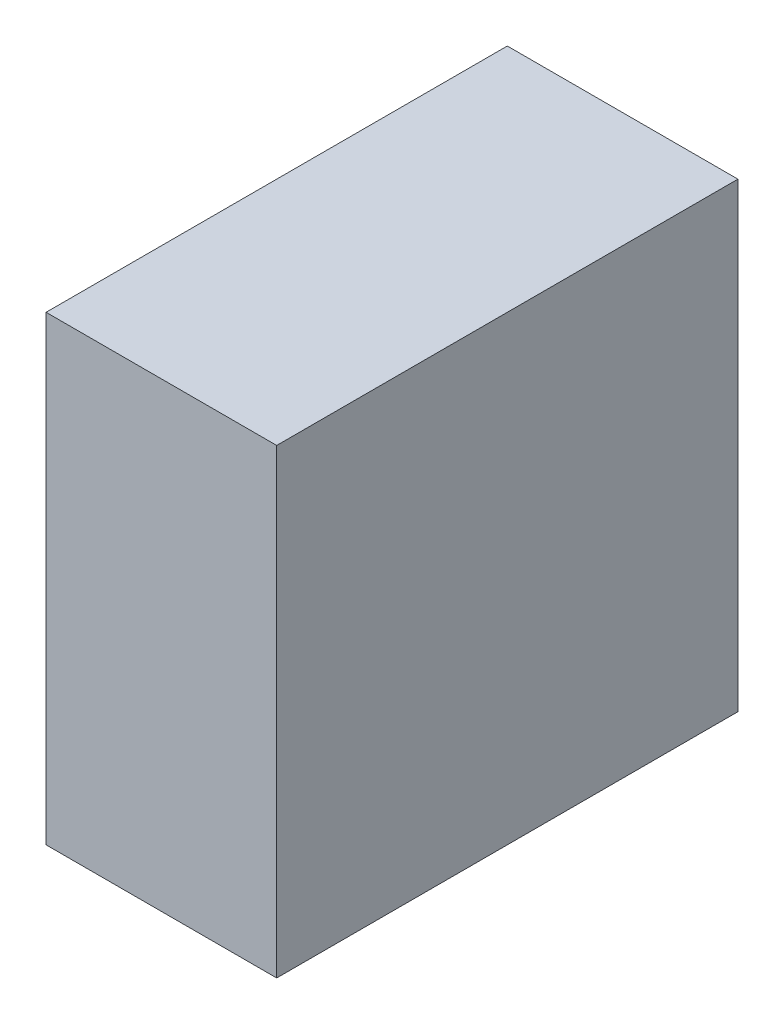
ISO-10303-21;
HEADER;
FILE_DESCRIPTION(('STEP AP214'),'2;1');
FILE_NAME('part.step','',(''),(''),'','','');
FILE_SCHEMA(('AUTOMOTIVE_DESIGN { 1 0 10303 214 1 1 1 1 }'));
ENDSEC;
DATA;
#1=APPLICATION_CONTEXT('core data for automotive mechanical design processes');
#2=APPLICATION_PROTOCOL_DEFINITION('international standard','automotive_design',2000,#1);
#3=PRODUCT_CONTEXT('',#1,'mechanical');
#4=PRODUCT('Part','Part','',(#3));
#5=PRODUCT_RELATED_PRODUCT_CATEGORY('part','',(#4));
#6=PRODUCT_DEFINITION_FORMATION('','',#4);
#7=PRODUCT_DEFINITION_CONTEXT('part definition',#1,'design');
#8=PRODUCT_DEFINITION('design','',#6,#7);
#9=PRODUCT_DEFINITION_SHAPE('','',#8);
#10=(LENGTH_UNIT() NAMED_UNIT(*) SI_UNIT(.MILLI.,.METRE.));
#11=(NAMED_UNIT(*) PLANE_ANGLE_UNIT() SI_UNIT($,.RADIAN.));
#12=(NAMED_UNIT(*) SI_UNIT($,.STERADIAN.) SOLID_ANGLE_UNIT());
#13=UNCERTAINTY_MEASURE_WITH_UNIT(LENGTH_MEASURE(1.E-05),#10,'distance_accuracy_value','');
#14=(GEOMETRIC_REPRESENTATION_CONTEXT(3) GLOBAL_UNCERTAINTY_ASSIGNED_CONTEXT((#13)) GLOBAL_UNIT_ASSIGNED_CONTEXT((#10,
#11,#12)) REPRESENTATION_CONTEXT('',''));
#15=CARTESIAN_POINT('',(0.,0.,0.));
#16=DIRECTION('',(0.,0.,1.));
#17=DIRECTION('',(1.,0.,0.));
#18=AXIS2_PLACEMENT_3D('',#15,#16,#17);
#19=CARTESIAN_POINT('',(15.,-30.,30.));
#20=DIRECTION('',(-1.,0.,0.));
#21=DIRECTION('',(0.,0.,1.));
#22=AXIS2_PLACEMENT_3D('',#19,#20,#21);
#23=PLANE('',#22);
#24=DIRECTION('',(0.,1.,0.));
#25=VECTOR('',#24,1.);
#26=CARTESIAN_POINT('',(15.,-30.,-30.));
#27=LINE('',#26,#25);
#28=CARTESIAN_POINT('',(15.,-30.,-30.));
#29=VERTEX_POINT('',#28);
#30=CARTESIAN_POINT('',(15.,30.,-30.));
#31=VERTEX_POINT('',#30);
#32=EDGE_CURVE('E107',#29,#31,#27,.T.);
#33=ORIENTED_EDGE('',*,*,#32,.T.);
#34=DIRECTION('',(0.,0.,-1.));
#35=VECTOR('',#34,1.);
#36=CARTESIAN_POINT('',(15.,30.,30.));
#37=LINE('',#36,#35);
#38=CARTESIAN_POINT('',(15.,30.,30.));
#39=VERTEX_POINT('',#38);
#40=EDGE_CURVE('E11',#39,#31,#37,.T.);
#41=ORIENTED_EDGE('',*,*,#40,.F.);
#42=DIRECTION('',(0.,1.,0.));
#43=VECTOR('',#42,1.);
#44=CARTESIAN_POINT('',(15.,-30.,30.));
#45=LINE('',#44,#43);
#46=CARTESIAN_POINT('',(15.,-30.,30.));
#47=VERTEX_POINT('',#46);
#48=EDGE_CURVE('E91',#47,#39,#45,.T.);
#49=ORIENTED_EDGE('',*,*,#48,.F.);
#50=DIRECTION('',(0.,0.,-1.));
#51=VECTOR('',#50,1.);
#52=CARTESIAN_POINT('',(15.,-30.,30.));
#53=LINE('',#52,#51);
#54=EDGE_CURVE('E103',#47,#29,#53,.T.);
#55=ORIENTED_EDGE('',*,*,#54,.T.);
#56=EDGE_LOOP('',(#33,#41,#49,#55));
#57=FACE_BOUND('',#56,.T.);
#58=ADVANCED_FACE('F39',(#57),#23,.F.);
#59=CARTESIAN_POINT('',(-15.,30.,30.));
#60=DIRECTION('',(0.,-1.,0.));
#61=DIRECTION('',(0.,0.,-1.));
#62=AXIS2_PLACEMENT_3D('',#59,#60,#61);
#63=PLANE('',#62);
#64=DIRECTION('',(-1.,0.,0.));
#65=VECTOR('',#64,1.);
#66=CARTESIAN_POINT('',(-15.,30.,-30.));
#67=LINE('',#66,#65);
#68=CARTESIAN_POINT('',(-15.,30.,-30.));
#69=VERTEX_POINT('',#68);
#70=EDGE_CURVE('E96',#31,#69,#67,.T.);
#71=ORIENTED_EDGE('',*,*,#70,.T.);
#72=DIRECTION('',(0.,0.,-1.));
#73=VECTOR('',#72,1.);
#74=CARTESIAN_POINT('',(-15.,30.,30.));
#75=LINE('',#74,#73);
#76=CARTESIAN_POINT('',(-15.,30.,30.));
#77=VERTEX_POINT('',#76);
#78=EDGE_CURVE('E48',#77,#69,#75,.T.);
#79=ORIENTED_EDGE('',*,*,#78,.F.);
#80=DIRECTION('',(-1.,0.,0.));
#81=VECTOR('',#80,1.);
#82=CARTESIAN_POINT('',(-15.,30.,30.));
#83=LINE('',#82,#81);
#84=EDGE_CURVE('E86',#39,#77,#83,.T.);
#85=ORIENTED_EDGE('',*,*,#84,.F.);
#86=ORIENTED_EDGE('',*,*,#40,.T.);
#87=EDGE_LOOP('',(#71,#79,#85,#86));
#88=FACE_BOUND('',#87,.T.);
#89=ADVANCED_FACE('F95',(#88),#63,.F.);
#90=CARTESIAN_POINT('',(-15.,-30.,30.));
#91=DIRECTION('',(1.,0.,0.));
#92=DIRECTION('',(0.,0.,-1.));
#93=AXIS2_PLACEMENT_3D('',#90,#91,#92);
#94=PLANE('',#93);
#95=DIRECTION('',(0.,-1.,0.));
#96=VECTOR('',#95,1.);
#97=CARTESIAN_POINT('',(-15.,-30.,-30.));
#98=LINE('',#97,#96);
#99=CARTESIAN_POINT('',(-15.,-30.,-30.));
#100=VERTEX_POINT('',#99);
#101=EDGE_CURVE('E73',#69,#100,#98,.T.);
#102=ORIENTED_EDGE('',*,*,#101,.T.);
#103=DIRECTION('',(0.,0.,-1.));
#104=VECTOR('',#103,1.);
#105=CARTESIAN_POINT('',(-15.,-30.,30.));
#106=LINE('',#105,#104);
#107=CARTESIAN_POINT('',(-15.,-30.,30.));
#108=VERTEX_POINT('',#107);
#109=EDGE_CURVE('E98',#108,#100,#106,.T.);
#110=ORIENTED_EDGE('',*,*,#109,.F.);
#111=DIRECTION('',(0.,-1.,0.));
#112=VECTOR('',#111,1.);
#113=CARTESIAN_POINT('',(-15.,-30.,30.));
#114=LINE('',#113,#112);
#115=EDGE_CURVE('E89',#77,#108,#114,.T.);
#116=ORIENTED_EDGE('',*,*,#115,.F.);
#117=ORIENTED_EDGE('',*,*,#78,.T.);
#118=EDGE_LOOP('',(#102,#110,#116,#117));
#119=FACE_BOUND('',#118,.T.);
#120=ADVANCED_FACE('F99',(#119),#94,.F.);
#121=CARTESIAN_POINT('',(-15.,-30.,30.));
#122=DIRECTION('',(0.,1.,0.));
#123=DIRECTION('',(0.,0.,1.));
#124=AXIS2_PLACEMENT_3D('',#121,#122,#123);
#125=PLANE('',#124);
#126=DIRECTION('',(1.,0.,0.));
#127=VECTOR('',#126,1.);
#128=CARTESIAN_POINT('',(-15.,-30.,-30.));
#129=LINE('',#128,#127);
#130=EDGE_CURVE('E79',#100,#29,#129,.T.);
#131=ORIENTED_EDGE('',*,*,#130,.T.);
#132=ORIENTED_EDGE('',*,*,#54,.F.);
#133=DIRECTION('',(1.,0.,0.));
#134=VECTOR('',#133,1.);
#135=CARTESIAN_POINT('',(-15.,-30.,30.));
#136=LINE('',#135,#134);
#137=EDGE_CURVE('E56',#108,#47,#136,.T.);
#138=ORIENTED_EDGE('',*,*,#137,.F.);
#139=ORIENTED_EDGE('',*,*,#109,.T.);
#140=EDGE_LOOP('',(#131,#132,#138,#139));
#141=FACE_BOUND('',#140,.T.);
#142=ADVANCED_FACE('F120',(#141),#125,.F.);
#143=CARTESIAN_POINT('',(0.,0.,30.));
#144=DIRECTION('',(0.,0.,-1.));
#145=DIRECTION('',(-1.,0.,0.));
#146=AXIS2_PLACEMENT_3D('',#143,#144,#145);
#147=PLANE('',#146);
#148=ORIENTED_EDGE('',*,*,#48,.T.);
#149=ORIENTED_EDGE('',*,*,#84,.T.);
#150=ORIENTED_EDGE('',*,*,#115,.T.);
#151=ORIENTED_EDGE('',*,*,#137,.T.);
#152=EDGE_LOOP('',(#148,#149,#150,#151));
#153=FACE_BOUND('',#152,.T.);
#154=ADVANCED_FACE('F87',(#153),#147,.F.);
#155=CARTESIAN_POINT('',(0.,0.,-30.));
#156=DIRECTION('',(0.,0.,-1.));
#157=DIRECTION('',(-1.,0.,0.));
#158=AXIS2_PLACEMENT_3D('',#155,#156,#157);
#159=PLANE('',#158);
#160=ORIENTED_EDGE('',*,*,#32,.F.);
#161=ORIENTED_EDGE('',*,*,#130,.F.);
#162=ORIENTED_EDGE('',*,*,#101,.F.);
#163=ORIENTED_EDGE('',*,*,#70,.F.);
#164=EDGE_LOOP('',(#160,#161,#162,#163));
#165=FACE_BOUND('',#164,.T.);
#166=ADVANCED_FACE('F123',(#165),#159,.T.);
#167=CLOSED_SHELL('',(#58,#89,#120,#142,#154,#166));
#168=MANIFOLD_SOLID_BREP('B2',#167);
#169=ADVANCED_BREP_SHAPE_REPRESENTATION('',(#18,#168),#14);
#170=SHAPE_DEFINITION_REPRESENTATION(#9,#169);
ENDSEC;
END-ISO-10303-21;
